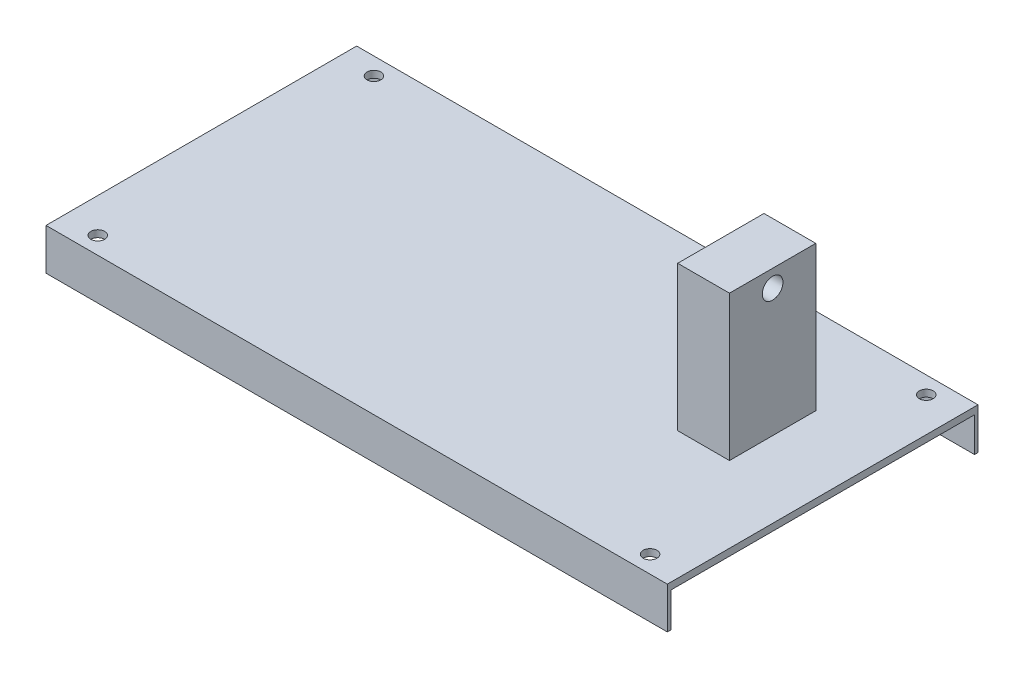
ISO-10303-21;
HEADER;
FILE_DESCRIPTION(('STEP AP214'),'2;1');
FILE_NAME('part.step','',(''),(''),'','','');
FILE_SCHEMA(('AUTOMOTIVE_DESIGN { 1 0 10303 214 1 1 1 1 }'));
ENDSEC;
DATA;
#1=APPLICATION_CONTEXT('core data for automotive mechanical design processes');
#2=APPLICATION_PROTOCOL_DEFINITION('international standard','automotive_design',2000,#1);
#3=PRODUCT_CONTEXT('',#1,'mechanical');
#4=PRODUCT('Part','Part','',(#3));
#5=PRODUCT_RELATED_PRODUCT_CATEGORY('part','',(#4));
#6=PRODUCT_DEFINITION_FORMATION('','',#4);
#7=PRODUCT_DEFINITION_CONTEXT('part definition',#1,'design');
#8=PRODUCT_DEFINITION('design','',#6,#7);
#9=PRODUCT_DEFINITION_SHAPE('','',#8);
#10=(LENGTH_UNIT() NAMED_UNIT(*) SI_UNIT(.MILLI.,.METRE.));
#11=(NAMED_UNIT(*) PLANE_ANGLE_UNIT() SI_UNIT($,.RADIAN.));
#12=(NAMED_UNIT(*) SI_UNIT($,.STERADIAN.) SOLID_ANGLE_UNIT());
#13=UNCERTAINTY_MEASURE_WITH_UNIT(LENGTH_MEASURE(1.E-05),#10,'distance_accuracy_value','');
#14=(GEOMETRIC_REPRESENTATION_CONTEXT(3) GLOBAL_UNCERTAINTY_ASSIGNED_CONTEXT((#13)) GLOBAL_UNIT_ASSIGNED_CONTEXT((#10,
#11,#12)) REPRESENTATION_CONTEXT('',''));
#15=CARTESIAN_POINT('',(0.,0.,0.));
#16=DIRECTION('',(0.,0.,1.));
#17=DIRECTION('',(1.,0.,0.));
#18=AXIS2_PLACEMENT_3D('',#15,#16,#17);
#19=CARTESIAN_POINT('',(0.,0.,0.));
#20=DIRECTION('',(0.,1.,0.));
#21=DIRECTION('',(0.,0.,1.));
#22=AXIS2_PLACEMENT_3D('',#19,#20,#21);
#23=PLANE('',#22);
#24=CARTESIAN_POINT('',(80.,0.,40.));
#25=DIRECTION('',(0.,1.,0.));
#26=DIRECTION('',(0.,0.,-1.));
#27=AXIS2_PLACEMENT_3D('',#24,#25,#26);
#28=CIRCLE('',#27,2.);
#29=CARTESIAN_POINT('',(80.,0.,38.));
#30=VERTEX_POINT('',#29);
#31=EDGE_CURVE('E148',#30,#30,#28,.T.);
#32=ORIENTED_EDGE('',*,*,#31,.T.);
#33=EDGE_LOOP('',(#32));
#34=FACE_BOUND('',#33,.T.);
#35=CARTESIAN_POINT('',(80.,0.,-40.));
#36=DIRECTION('',(0.,1.,0.));
#37=DIRECTION('',(0.,0.,-1.));
#38=AXIS2_PLACEMENT_3D('',#35,#36,#37);
#39=CIRCLE('',#38,2.);
#40=CARTESIAN_POINT('',(80.,0.,-42.));
#41=VERTEX_POINT('',#40);
#42=EDGE_CURVE('E145',#41,#41,#39,.T.);
#43=ORIENTED_EDGE('',*,*,#42,.T.);
#44=EDGE_LOOP('',(#43));
#45=FACE_BOUND('',#44,.T.);
#46=CARTESIAN_POINT('',(-80.,0.,40.));
#47=DIRECTION('',(0.,-1.,0.));
#48=DIRECTION('',(0.,0.,-1.));
#49=AXIS2_PLACEMENT_3D('',#46,#47,#48);
#50=CIRCLE('',#49,2.);
#51=CARTESIAN_POINT('',(-80.,0.,38.));
#52=VERTEX_POINT('',#51);
#53=EDGE_CURVE('E157',#52,#52,#50,.T.);
#54=ORIENTED_EDGE('',*,*,#53,.F.);
#55=EDGE_LOOP('',(#54));
#56=FACE_BOUND('',#55,.T.);
#57=CARTESIAN_POINT('',(-80.,0.,-40.));
#58=DIRECTION('',(0.,-1.,0.));
#59=DIRECTION('',(0.,0.,-1.));
#60=AXIS2_PLACEMENT_3D('',#57,#58,#59);
#61=CIRCLE('',#60,2.);
#62=CARTESIAN_POINT('',(-80.,0.,-42.));
#63=VERTEX_POINT('',#62);
#64=EDGE_CURVE('E161',#63,#63,#61,.T.);
#65=ORIENTED_EDGE('',*,*,#64,.F.);
#66=EDGE_LOOP('',(#65));
#67=FACE_BOUND('',#66,.T.);
#68=DIRECTION('',(0.,0.,1.));
#69=VECTOR('',#68,1.);
#70=CARTESIAN_POINT('',(-90.,0.,-45.));
#71=LINE('',#70,#69);
#72=CARTESIAN_POINT('',(-90.,0.,-44.));
#73=VERTEX_POINT('',#72);
#74=CARTESIAN_POINT('',(-90.,0.,44.));
#75=VERTEX_POINT('',#74);
#76=EDGE_CURVE('E211',#73,#75,#71,.T.);
#77=ORIENTED_EDGE('',*,*,#76,.F.);
#78=DIRECTION('',(1.,0.,0.));
#79=VECTOR('',#78,1.);
#80=CARTESIAN_POINT('',(-90.,0.,-44.));
#81=LINE('',#80,#79);
#82=CARTESIAN_POINT('',(90.,0.,-44.));
#83=VERTEX_POINT('',#82);
#84=EDGE_CURVE('E169',#73,#83,#81,.T.);
#85=ORIENTED_EDGE('',*,*,#84,.T.);
#86=DIRECTION('',(0.,0.,-1.));
#87=VECTOR('',#86,1.);
#88=CARTESIAN_POINT('',(90.,0.,-45.));
#89=LINE('',#88,#87);
#90=CARTESIAN_POINT('',(90.,0.,44.));
#91=VERTEX_POINT('',#90);
#92=EDGE_CURVE('E206',#91,#83,#89,.T.);
#93=ORIENTED_EDGE('',*,*,#92,.F.);
#94=DIRECTION('',(1.,0.,0.));
#95=VECTOR('',#94,1.);
#96=CARTESIAN_POINT('',(-90.,0.,44.));
#97=LINE('',#96,#95);
#98=EDGE_CURVE('E186',#75,#91,#97,.T.);
#99=ORIENTED_EDGE('',*,*,#98,.F.);
#100=EDGE_LOOP('',(#77,#85,#93,#99));
#101=FACE_BOUND('',#100,.T.);
#102=ADVANCED_FACE('F35',(#34,#45,#56,#67,#101),#23,.F.);
#103=CARTESIAN_POINT('',(90.,2.,-45.));
#104=DIRECTION('',(-1.,0.,0.));
#105=DIRECTION('',(0.,0.,1.));
#106=AXIS2_PLACEMENT_3D('',#103,#104,#105);
#107=PLANE('',#106);
#108=DIRECTION('',(0.,-1.,0.));
#109=VECTOR('',#108,1.);
#110=CARTESIAN_POINT('',(90.,2.,45.));
#111=LINE('',#110,#109);
#112=CARTESIAN_POINT('',(90.,2.,45.));
#113=VERTEX_POINT('',#112);
#114=CARTESIAN_POINT('',(90.,-10.,45.));
#115=VERTEX_POINT('',#114);
#116=EDGE_CURVE('E217',#113,#115,#111,.T.);
#117=ORIENTED_EDGE('',*,*,#116,.T.);
#118=DIRECTION('',(0.,0.,1.));
#119=VECTOR('',#118,1.);
#120=CARTESIAN_POINT('',(90.,-10.,45.));
#121=LINE('',#120,#119);
#122=CARTESIAN_POINT('',(90.,-10.,44.));
#123=VERTEX_POINT('',#122);
#124=EDGE_CURVE('E192',#123,#115,#121,.T.);
#125=ORIENTED_EDGE('',*,*,#124,.F.);
#126=DIRECTION('',(0.,1.,0.));
#127=VECTOR('',#126,1.);
#128=CARTESIAN_POINT('',(90.,-10.,44.));
#129=LINE('',#128,#127);
#130=EDGE_CURVE('E198',#123,#91,#129,.T.);
#131=ORIENTED_EDGE('',*,*,#130,.T.);
#132=ORIENTED_EDGE('',*,*,#92,.T.);
#133=DIRECTION('',(0.,1.,0.));
#134=VECTOR('',#133,1.);
#135=CARTESIAN_POINT('',(90.,-10.,-44.));
#136=LINE('',#135,#134);
#137=CARTESIAN_POINT('',(90.,-10.,-44.));
#138=VERTEX_POINT('',#137);
#139=EDGE_CURVE('E184',#138,#83,#136,.T.);
#140=ORIENTED_EDGE('',*,*,#139,.F.);
#141=DIRECTION('',(0.,0.,-1.));
#142=VECTOR('',#141,1.);
#143=CARTESIAN_POINT('',(90.,-10.,-45.));
#144=LINE('',#143,#142);
#145=CARTESIAN_POINT('',(90.,-10.,-45.));
#146=VERTEX_POINT('',#145);
#147=EDGE_CURVE('E172',#138,#146,#144,.T.);
#148=ORIENTED_EDGE('',*,*,#147,.T.);
#149=DIRECTION('',(0.,-1.,0.));
#150=VECTOR('',#149,1.);
#151=CARTESIAN_POINT('',(90.,2.,-45.));
#152=LINE('',#151,#150);
#153=CARTESIAN_POINT('',(90.,2.,-45.));
#154=VERTEX_POINT('',#153);
#155=EDGE_CURVE('E11',#154,#146,#152,.T.);
#156=ORIENTED_EDGE('',*,*,#155,.F.);
#157=DIRECTION('',(0.,0.,-1.));
#158=VECTOR('',#157,1.);
#159=CARTESIAN_POINT('',(90.,2.,-45.));
#160=LINE('',#159,#158);
#161=EDGE_CURVE('E207',#113,#154,#160,.T.);
#162=ORIENTED_EDGE('',*,*,#161,.F.);
#163=EDGE_LOOP('',(#117,#125,#131,#132,#140,#148,#156,#162));
#164=FACE_BOUND('',#163,.T.);
#165=ADVANCED_FACE('F37',(#164),#107,.F.);
#166=CARTESIAN_POINT('',(-90.,2.,-45.));
#167=DIRECTION('',(0.,0.,1.));
#168=DIRECTION('',(1.,0.,0.));
#169=AXIS2_PLACEMENT_3D('',#166,#167,#168);
#170=PLANE('',#169);
#171=ORIENTED_EDGE('',*,*,#155,.T.);
#172=DIRECTION('',(-1.,0.,0.));
#173=VECTOR('',#172,1.);
#174=CARTESIAN_POINT('',(-90.,-10.,-45.));
#175=LINE('',#174,#173);
#176=CARTESIAN_POINT('',(-90.,-10.,-45.));
#177=VERTEX_POINT('',#176);
#178=EDGE_CURVE('E168',#146,#177,#175,.T.);
#179=ORIENTED_EDGE('',*,*,#178,.T.);
#180=DIRECTION('',(0.,-1.,0.));
#181=VECTOR('',#180,1.);
#182=CARTESIAN_POINT('',(-90.,2.,-45.));
#183=LINE('',#182,#181);
#184=CARTESIAN_POINT('',(-90.,2.,-45.));
#185=VERTEX_POINT('',#184);
#186=EDGE_CURVE('E44',#185,#177,#183,.T.);
#187=ORIENTED_EDGE('',*,*,#186,.F.);
#188=DIRECTION('',(-1.,0.,0.));
#189=VECTOR('',#188,1.);
#190=CARTESIAN_POINT('',(-90.,2.,-45.));
#191=LINE('',#190,#189);
#192=EDGE_CURVE('E210',#154,#185,#191,.T.);
#193=ORIENTED_EDGE('',*,*,#192,.F.);
#194=EDGE_LOOP('',(#171,#179,#187,#193));
#195=FACE_BOUND('',#194,.T.);
#196=ADVANCED_FACE('F270',(#195),#170,.F.);
#197=CARTESIAN_POINT('',(-90.,2.,-45.));
#198=DIRECTION('',(1.,0.,0.));
#199=DIRECTION('',(0.,0.,-1.));
#200=AXIS2_PLACEMENT_3D('',#197,#198,#199);
#201=PLANE('',#200);
#202=ORIENTED_EDGE('',*,*,#186,.T.);
#203=DIRECTION('',(0.,0.,1.));
#204=VECTOR('',#203,1.);
#205=CARTESIAN_POINT('',(-90.,-10.,-45.));
#206=LINE('',#205,#204);
#207=CARTESIAN_POINT('',(-90.,-10.,-44.));
#208=VERTEX_POINT('',#207);
#209=EDGE_CURVE('E165',#177,#208,#206,.T.);
#210=ORIENTED_EDGE('',*,*,#209,.T.);
#211=DIRECTION('',(0.,1.,0.));
#212=VECTOR('',#211,1.);
#213=CARTESIAN_POINT('',(-90.,-10.,-44.));
#214=LINE('',#213,#212);
#215=EDGE_CURVE('E178',#208,#73,#214,.T.);
#216=ORIENTED_EDGE('',*,*,#215,.T.);
#217=ORIENTED_EDGE('',*,*,#76,.T.);
#218=DIRECTION('',(0.,1.,0.));
#219=VECTOR('',#218,1.);
#220=CARTESIAN_POINT('',(-90.,-10.,44.));
#221=LINE('',#220,#219);
#222=CARTESIAN_POINT('',(-90.,-10.,44.));
#223=VERTEX_POINT('',#222);
#224=EDGE_CURVE('E203',#223,#75,#221,.T.);
#225=ORIENTED_EDGE('',*,*,#224,.F.);
#226=DIRECTION('',(0.,0.,-1.));
#227=VECTOR('',#226,1.);
#228=CARTESIAN_POINT('',(-90.,-10.,45.));
#229=LINE('',#228,#227);
#230=CARTESIAN_POINT('',(-90.,-10.,45.));
#231=VERTEX_POINT('',#230);
#232=EDGE_CURVE('E187',#231,#223,#229,.T.);
#233=ORIENTED_EDGE('',*,*,#232,.F.);
#234=DIRECTION('',(0.,-1.,0.));
#235=VECTOR('',#234,1.);
#236=CARTESIAN_POINT('',(-90.,2.,45.));
#237=LINE('',#236,#235);
#238=CARTESIAN_POINT('',(-90.,2.,45.));
#239=VERTEX_POINT('',#238);
#240=EDGE_CURVE('E222',#239,#231,#237,.T.);
#241=ORIENTED_EDGE('',*,*,#240,.F.);
#242=DIRECTION('',(0.,0.,1.));
#243=VECTOR('',#242,1.);
#244=CARTESIAN_POINT('',(-90.,2.,-45.));
#245=LINE('',#244,#243);
#246=EDGE_CURVE('E213',#185,#239,#245,.T.);
#247=ORIENTED_EDGE('',*,*,#246,.F.);
#248=EDGE_LOOP('',(#202,#210,#216,#217,#225,#233,#241,#247));
#249=FACE_BOUND('',#248,.T.);
#250=ADVANCED_FACE('F256',(#249),#201,.F.);
#251=CARTESIAN_POINT('',(-90.,2.,45.));
#252=DIRECTION('',(0.,0.,-1.));
#253=DIRECTION('',(-1.,0.,0.));
#254=AXIS2_PLACEMENT_3D('',#251,#252,#253);
#255=PLANE('',#254);
#256=ORIENTED_EDGE('',*,*,#240,.T.);
#257=DIRECTION('',(-1.,0.,0.));
#258=VECTOR('',#257,1.);
#259=CARTESIAN_POINT('',(-90.,-10.,45.));
#260=LINE('',#259,#258);
#261=EDGE_CURVE('E195',#115,#231,#260,.T.);
#262=ORIENTED_EDGE('',*,*,#261,.F.);
#263=ORIENTED_EDGE('',*,*,#116,.F.);
#264=DIRECTION('',(1.,0.,0.));
#265=VECTOR('',#264,1.);
#266=CARTESIAN_POINT('',(-90.,2.,45.));
#267=LINE('',#266,#265);
#268=EDGE_CURVE('E215',#239,#113,#267,.T.);
#269=ORIENTED_EDGE('',*,*,#268,.F.);
#270=EDGE_LOOP('',(#256,#262,#263,#269));
#271=FACE_BOUND('',#270,.T.);
#272=ADVANCED_FACE('F280',(#271),#255,.F.);
#273=CARTESIAN_POINT('',(0.,2.,0.));
#274=DIRECTION('',(0.,1.,0.));
#275=DIRECTION('',(0.,0.,1.));
#276=AXIS2_PLACEMENT_3D('',#273,#274,#275);
#277=PLANE('',#276);
#278=DIRECTION('',(0.,0.,1.));
#279=VECTOR('',#278,1.);
#280=CARTESIAN_POINT('',(53.,2.,-20.));
#281=LINE('',#280,#279);
#282=CARTESIAN_POINT('',(53.,2.,-20.));
#283=VERTEX_POINT('',#282);
#284=CARTESIAN_POINT('',(53.,2.,5.));
#285=VERTEX_POINT('',#284);
#286=EDGE_CURVE('E52',#283,#285,#281,.T.);
#287=ORIENTED_EDGE('',*,*,#286,.F.);
#288=DIRECTION('',(-1.,0.,0.));
#289=VECTOR('',#288,1.);
#290=CARTESIAN_POINT('',(53.,2.,-20.));
#291=LINE('',#290,#289);
#292=CARTESIAN_POINT('',(68.,2.,-20.));
#293=VERTEX_POINT('',#292);
#294=EDGE_CURVE('E56',#293,#283,#291,.T.);
#295=ORIENTED_EDGE('',*,*,#294,.F.);
#296=DIRECTION('',(0.,0.,-1.));
#297=VECTOR('',#296,1.);
#298=CARTESIAN_POINT('',(68.,2.,-20.));
#299=LINE('',#298,#297);
#300=CARTESIAN_POINT('',(68.,2.,5.));
#301=VERTEX_POINT('',#300);
#302=EDGE_CURVE('E490',#301,#293,#299,.T.);
#303=ORIENTED_EDGE('',*,*,#302,.F.);
#304=DIRECTION('',(1.,0.,0.));
#305=VECTOR('',#304,1.);
#306=CARTESIAN_POINT('',(53.,2.,5.));
#307=LINE('',#306,#305);
#308=EDGE_CURVE('E482',#285,#301,#307,.T.);
#309=ORIENTED_EDGE('',*,*,#308,.F.);
#310=EDGE_LOOP('',(#287,#295,#303,#309));
#311=FACE_BOUND('',#310,.T.);
#312=CARTESIAN_POINT('',(80.,2.,40.));
#313=DIRECTION('',(0.,1.,0.));
#314=DIRECTION('',(0.,0.,1.));
#315=AXIS2_PLACEMENT_3D('',#312,#313,#314);
#316=CIRCLE('',#315,2.);
#317=CARTESIAN_POINT('',(80.,2.,42.));
#318=VERTEX_POINT('',#317);
#319=EDGE_CURVE('E164',#318,#318,#316,.F.);
#320=ORIENTED_EDGE('',*,*,#319,.T.);
#321=EDGE_LOOP('',(#320));
#322=FACE_BOUND('',#321,.T.);
#323=CARTESIAN_POINT('',(80.,2.,-40.));
#324=DIRECTION('',(0.,1.,0.));
#325=DIRECTION('',(0.,0.,1.));
#326=AXIS2_PLACEMENT_3D('',#323,#324,#325);
#327=CIRCLE('',#326,2.);
#328=CARTESIAN_POINT('',(80.,2.,-38.));
#329=VERTEX_POINT('',#328);
#330=EDGE_CURVE('E155',#329,#329,#327,.F.);
#331=ORIENTED_EDGE('',*,*,#330,.T.);
#332=EDGE_LOOP('',(#331));
#333=FACE_BOUND('',#332,.T.);
#334=CARTESIAN_POINT('',(-80.,2.,40.));
#335=DIRECTION('',(0.,1.,0.));
#336=DIRECTION('',(0.,0.,1.));
#337=AXIS2_PLACEMENT_3D('',#334,#335,#336);
#338=CIRCLE('',#337,2.);
#339=CARTESIAN_POINT('',(-80.,2.,42.));
#340=VERTEX_POINT('',#339);
#341=EDGE_CURVE('E181',#340,#340,#338,.T.);
#342=ORIENTED_EDGE('',*,*,#341,.F.);
#343=EDGE_LOOP('',(#342));
#344=FACE_BOUND('',#343,.T.);
#345=CARTESIAN_POINT('',(-80.,2.,-40.));
#346=DIRECTION('',(0.,1.,0.));
#347=DIRECTION('',(0.,0.,1.));
#348=AXIS2_PLACEMENT_3D('',#345,#346,#347);
#349=CIRCLE('',#348,2.);
#350=CARTESIAN_POINT('',(-80.,2.,-38.));
#351=VERTEX_POINT('',#350);
#352=EDGE_CURVE('E160',#351,#351,#349,.T.);
#353=ORIENTED_EDGE('',*,*,#352,.F.);
#354=EDGE_LOOP('',(#353));
#355=FACE_BOUND('',#354,.T.);
#356=ORIENTED_EDGE('',*,*,#161,.T.);
#357=ORIENTED_EDGE('',*,*,#192,.T.);
#358=ORIENTED_EDGE('',*,*,#246,.T.);
#359=ORIENTED_EDGE('',*,*,#268,.T.);
#360=EDGE_LOOP('',(#356,#357,#358,#359));
#361=FACE_BOUND('',#360,.T.);
#362=ADVANCED_FACE('F233',(#311,#322,#333,#344,#355,#361),#277,.T.);
#363=CARTESIAN_POINT('',(-90.,-10.,44.));
#364=DIRECTION('',(0.,0.,1.));
#365=DIRECTION('',(1.,0.,0.));
#366=AXIS2_PLACEMENT_3D('',#363,#364,#365);
#367=PLANE('',#366);
#368=ORIENTED_EDGE('',*,*,#98,.T.);
#369=ORIENTED_EDGE('',*,*,#130,.F.);
#370=DIRECTION('',(1.,0.,0.));
#371=VECTOR('',#370,1.);
#372=CARTESIAN_POINT('',(-90.,-10.,44.));
#373=LINE('',#372,#371);
#374=EDGE_CURVE('E190',#223,#123,#373,.T.);
#375=ORIENTED_EDGE('',*,*,#374,.F.);
#376=ORIENTED_EDGE('',*,*,#224,.T.);
#377=EDGE_LOOP('',(#368,#369,#375,#376));
#378=FACE_BOUND('',#377,.T.);
#379=ADVANCED_FACE('F285',(#378),#367,.F.);
#380=CARTESIAN_POINT('',(0.,-10.,0.));
#381=DIRECTION('',(0.,-1.,0.));
#382=DIRECTION('',(0.,0.,-1.));
#383=AXIS2_PLACEMENT_3D('',#380,#381,#382);
#384=PLANE('',#383);
#385=ORIENTED_EDGE('',*,*,#232,.T.);
#386=ORIENTED_EDGE('',*,*,#374,.T.);
#387=ORIENTED_EDGE('',*,*,#124,.T.);
#388=ORIENTED_EDGE('',*,*,#261,.T.);
#389=EDGE_LOOP('',(#385,#386,#387,#388));
#390=FACE_BOUND('',#389,.T.);
#391=ADVANCED_FACE('F282',(#390),#384,.T.);
#392=CARTESIAN_POINT('',(-90.,-10.,-44.));
#393=DIRECTION('',(0.,0.,1.));
#394=DIRECTION('',(1.,0.,0.));
#395=AXIS2_PLACEMENT_3D('',#392,#393,#394);
#396=PLANE('',#395);
#397=ORIENTED_EDGE('',*,*,#84,.F.);
#398=ORIENTED_EDGE('',*,*,#215,.F.);
#399=DIRECTION('',(1.,0.,0.));
#400=VECTOR('',#399,1.);
#401=CARTESIAN_POINT('',(-90.,-10.,-44.));
#402=LINE('',#401,#400);
#403=EDGE_CURVE('E175',#208,#138,#402,.T.);
#404=ORIENTED_EDGE('',*,*,#403,.T.);
#405=ORIENTED_EDGE('',*,*,#139,.T.);
#406=EDGE_LOOP('',(#397,#398,#404,#405));
#407=FACE_BOUND('',#406,.T.);
#408=ADVANCED_FACE('F261',(#407),#396,.T.);
#409=CARTESIAN_POINT('',(0.,-10.,0.));
#410=DIRECTION('',(0.,-1.,0.));
#411=DIRECTION('',(0.,0.,1.));
#412=AXIS2_PLACEMENT_3D('',#409,#410,#411);
#413=PLANE('',#412);
#414=ORIENTED_EDGE('',*,*,#209,.F.);
#415=ORIENTED_EDGE('',*,*,#178,.F.);
#416=ORIENTED_EDGE('',*,*,#147,.F.);
#417=ORIENTED_EDGE('',*,*,#403,.F.);
#418=EDGE_LOOP('',(#414,#415,#416,#417));
#419=FACE_BOUND('',#418,.T.);
#420=ADVANCED_FACE('F267',(#419),#413,.T.);
#421=CARTESIAN_POINT('',(-80.,10.,-40.));
#422=DIRECTION('',(0.,-1.,0.));
#423=DIRECTION('',(0.,0.,-1.));
#424=AXIS2_PLACEMENT_3D('',#421,#422,#423);
#425=CYLINDRICAL_SURFACE('',#424,2.);
#426=ORIENTED_EDGE('',*,*,#352,.T.);
#427=EDGE_LOOP('',(#426));
#428=FACE_BOUND('',#427,.T.);
#429=ORIENTED_EDGE('',*,*,#64,.T.);
#430=EDGE_LOOP('',(#429));
#431=FACE_BOUND('',#430,.T.);
#432=ADVANCED_FACE('F399',(#428,#431),#425,.F.);
#433=CARTESIAN_POINT('',(-80.,10.,40.));
#434=DIRECTION('',(0.,-1.,0.));
#435=DIRECTION('',(0.,0.,-1.));
#436=AXIS2_PLACEMENT_3D('',#433,#434,#435);
#437=CYLINDRICAL_SURFACE('',#436,2.);
#438=ORIENTED_EDGE('',*,*,#341,.T.);
#439=EDGE_LOOP('',(#438));
#440=FACE_BOUND('',#439,.T.);
#441=ORIENTED_EDGE('',*,*,#53,.T.);
#442=EDGE_LOOP('',(#441));
#443=FACE_BOUND('',#442,.T.);
#444=ADVANCED_FACE('F319',(#440,#443),#437,.F.);
#445=CARTESIAN_POINT('',(80.,10.,-40.));
#446=DIRECTION('',(0.,-1.,0.));
#447=DIRECTION('',(0.,0.,-1.));
#448=AXIS2_PLACEMENT_3D('',#445,#446,#447);
#449=CYLINDRICAL_SURFACE('',#448,2.);
#450=ORIENTED_EDGE('',*,*,#330,.F.);
#451=EDGE_LOOP('',(#450));
#452=FACE_BOUND('',#451,.T.);
#453=ORIENTED_EDGE('',*,*,#42,.F.);
#454=EDGE_LOOP('',(#453));
#455=FACE_BOUND('',#454,.T.);
#456=ADVANCED_FACE('F239',(#452,#455),#449,.F.);
#457=CARTESIAN_POINT('',(80.,10.,40.));
#458=DIRECTION('',(0.,-1.,0.));
#459=DIRECTION('',(0.,0.,-1.));
#460=AXIS2_PLACEMENT_3D('',#457,#458,#459);
#461=CYLINDRICAL_SURFACE('',#460,2.);
#462=ORIENTED_EDGE('',*,*,#319,.F.);
#463=EDGE_LOOP('',(#462));
#464=FACE_BOUND('',#463,.T.);
#465=ORIENTED_EDGE('',*,*,#31,.F.);
#466=EDGE_LOOP('',(#465));
#467=FACE_BOUND('',#466,.T.);
#468=ADVANCED_FACE('F236',(#464,#467),#461,.F.);
#469=CARTESIAN_POINT('',(53.,44.,-20.));
#470=DIRECTION('',(1.,0.,0.));
#471=DIRECTION('',(0.,0.,-1.));
#472=AXIS2_PLACEMENT_3D('',#469,#470,#471);
#473=PLANE('',#472);
#474=CARTESIAN_POINT('',(53.,39.,-7.5));
#475=DIRECTION('',(-1.,0.,0.));
#476=DIRECTION('',(0.,0.,1.));
#477=AXIS2_PLACEMENT_3D('',#474,#475,#476);
#478=CIRCLE('',#477,3.);
#479=CARTESIAN_POINT('',(53.,39.,-4.49999999999999));
#480=VERTEX_POINT('',#479);
#481=EDGE_CURVE('E479',#480,#480,#478,.T.);
#482=ORIENTED_EDGE('',*,*,#481,.F.);
#483=EDGE_LOOP('',(#482));
#484=FACE_BOUND('',#483,.T.);
#485=ORIENTED_EDGE('',*,*,#286,.T.);
#486=DIRECTION('',(0.,-1.,0.));
#487=VECTOR('',#486,1.);
#488=CARTESIAN_POINT('',(53.,44.,5.));
#489=LINE('',#488,#487);
#490=CARTESIAN_POINT('',(53.,44.,5.));
#491=VERTEX_POINT('',#490);
#492=EDGE_CURVE('E128',#491,#285,#489,.T.);
#493=ORIENTED_EDGE('',*,*,#492,.F.);
#494=DIRECTION('',(0.,0.,1.));
#495=VECTOR('',#494,1.);
#496=CARTESIAN_POINT('',(53.,44.,-20.));
#497=LINE('',#496,#495);
#498=CARTESIAN_POINT('',(53.,44.,-20.));
#499=VERTEX_POINT('',#498);
#500=EDGE_CURVE('E134',#499,#491,#497,.T.);
#501=ORIENTED_EDGE('',*,*,#500,.F.);
#502=DIRECTION('',(0.,-1.,0.));
#503=VECTOR('',#502,1.);
#504=CARTESIAN_POINT('',(53.,44.,-20.));
#505=LINE('',#504,#503);
#506=EDGE_CURVE('E487',#499,#283,#505,.T.);
#507=ORIENTED_EDGE('',*,*,#506,.T.);
#508=EDGE_LOOP('',(#485,#493,#501,#507));
#509=FACE_BOUND('',#508,.T.);
#510=ADVANCED_FACE('F144',(#484,#509),#473,.F.);
#511=CARTESIAN_POINT('',(53.,44.,5.));
#512=DIRECTION('',(0.,0.,-1.));
#513=DIRECTION('',(-1.,0.,0.));
#514=AXIS2_PLACEMENT_3D('',#511,#512,#513);
#515=PLANE('',#514);
#516=ORIENTED_EDGE('',*,*,#308,.T.);
#517=DIRECTION('',(0.,-1.,0.));
#518=VECTOR('',#517,1.);
#519=CARTESIAN_POINT('',(68.,44.,5.));
#520=LINE('',#519,#518);
#521=CARTESIAN_POINT('',(68.,44.,5.));
#522=VERTEX_POINT('',#521);
#523=EDGE_CURVE('E130',#522,#301,#520,.T.);
#524=ORIENTED_EDGE('',*,*,#523,.F.);
#525=DIRECTION('',(1.,0.,0.));
#526=VECTOR('',#525,1.);
#527=CARTESIAN_POINT('',(53.,44.,5.));
#528=LINE('',#527,#526);
#529=EDGE_CURVE('E123',#491,#522,#528,.T.);
#530=ORIENTED_EDGE('',*,*,#529,.F.);
#531=ORIENTED_EDGE('',*,*,#492,.T.);
#532=EDGE_LOOP('',(#516,#524,#530,#531));
#533=FACE_BOUND('',#532,.T.);
#534=ADVANCED_FACE('F126',(#533),#515,.F.);
#535=CARTESIAN_POINT('',(68.,44.,-20.));
#536=DIRECTION('',(-1.,0.,0.));
#537=DIRECTION('',(0.,0.,1.));
#538=AXIS2_PLACEMENT_3D('',#535,#536,#537);
#539=PLANE('',#538);
#540=CARTESIAN_POINT('',(68.,39.,-7.5));
#541=DIRECTION('',(-1.,0.,0.));
#542=DIRECTION('',(0.,0.,1.));
#543=AXIS2_PLACEMENT_3D('',#540,#541,#542);
#544=CIRCLE('',#543,3.);
#545=CARTESIAN_POINT('',(68.,39.,-4.49999999999999));
#546=VERTEX_POINT('',#545);
#547=EDGE_CURVE('E39',#546,#546,#544,.T.);
#548=ORIENTED_EDGE('',*,*,#547,.T.);
#549=EDGE_LOOP('',(#548));
#550=FACE_BOUND('',#549,.T.);
#551=ORIENTED_EDGE('',*,*,#302,.T.);
#552=DIRECTION('',(0.,-1.,0.));
#553=VECTOR('',#552,1.);
#554=CARTESIAN_POINT('',(68.,44.,-20.));
#555=LINE('',#554,#553);
#556=CARTESIAN_POINT('',(68.,44.,-20.));
#557=VERTEX_POINT('',#556);
#558=EDGE_CURVE('E150',#557,#293,#555,.T.);
#559=ORIENTED_EDGE('',*,*,#558,.F.);
#560=DIRECTION('',(0.,0.,-1.));
#561=VECTOR('',#560,1.);
#562=CARTESIAN_POINT('',(68.,44.,-20.));
#563=LINE('',#562,#561);
#564=EDGE_CURVE('E133',#522,#557,#563,.T.);
#565=ORIENTED_EDGE('',*,*,#564,.F.);
#566=ORIENTED_EDGE('',*,*,#523,.T.);
#567=EDGE_LOOP('',(#551,#559,#565,#566));
#568=FACE_BOUND('',#567,.T.);
#569=ADVANCED_FACE('F347',(#550,#568),#539,.F.);
#570=CARTESIAN_POINT('',(53.,44.,-20.));
#571=DIRECTION('',(0.,0.,1.));
#572=DIRECTION('',(1.,0.,0.));
#573=AXIS2_PLACEMENT_3D('',#570,#571,#572);
#574=PLANE('',#573);
#575=ORIENTED_EDGE('',*,*,#294,.T.);
#576=ORIENTED_EDGE('',*,*,#506,.F.);
#577=DIRECTION('',(-1.,0.,0.));
#578=VECTOR('',#577,1.);
#579=CARTESIAN_POINT('',(53.,44.,-20.));
#580=LINE('',#579,#578);
#581=EDGE_CURVE('E139',#557,#499,#580,.T.);
#582=ORIENTED_EDGE('',*,*,#581,.F.);
#583=ORIENTED_EDGE('',*,*,#558,.T.);
#584=EDGE_LOOP('',(#575,#576,#582,#583));
#585=FACE_BOUND('',#584,.T.);
#586=ADVANCED_FACE('F354',(#585),#574,.F.);
#587=CARTESIAN_POINT('',(0.,44.,0.));
#588=DIRECTION('',(0.,1.,0.));
#589=DIRECTION('',(0.,0.,1.));
#590=AXIS2_PLACEMENT_3D('',#587,#588,#589);
#591=PLANE('',#590);
#592=ORIENTED_EDGE('',*,*,#500,.T.);
#593=ORIENTED_EDGE('',*,*,#529,.T.);
#594=ORIENTED_EDGE('',*,*,#564,.T.);
#595=ORIENTED_EDGE('',*,*,#581,.T.);
#596=EDGE_LOOP('',(#592,#593,#594,#595));
#597=FACE_BOUND('',#596,.T.);
#598=ADVANCED_FACE('F137',(#597),#591,.T.);
#599=CARTESIAN_POINT('',(102.,39.,-7.5));
#600=DIRECTION('',(-1.,0.,0.));
#601=DIRECTION('',(0.,0.,1.));
#602=AXIS2_PLACEMENT_3D('',#599,#600,#601);
#603=CYLINDRICAL_SURFACE('',#602,3.);
#604=ORIENTED_EDGE('',*,*,#481,.T.);
#605=EDGE_LOOP('',(#604));
#606=FACE_BOUND('',#605,.T.);
#607=ORIENTED_EDGE('',*,*,#547,.F.);
#608=EDGE_LOOP('',(#607));
#609=FACE_BOUND('',#608,.T.);
#610=ADVANCED_FACE('F368',(#606,#609),#603,.F.);
#611=CLOSED_SHELL('',(#102,#165,#196,#250,#272,#362,#379,#391,#408,#420,#432,#444,#456,#468,
#510,#534,#569,#586,#598,#610));
#612=MANIFOLD_SOLID_BREP('B2',#611);
#613=ADVANCED_BREP_SHAPE_REPRESENTATION('',(#18,#612),#14);
#614=SHAPE_DEFINITION_REPRESENTATION(#9,#613);
ENDSEC;
END-ISO-10303-21;
